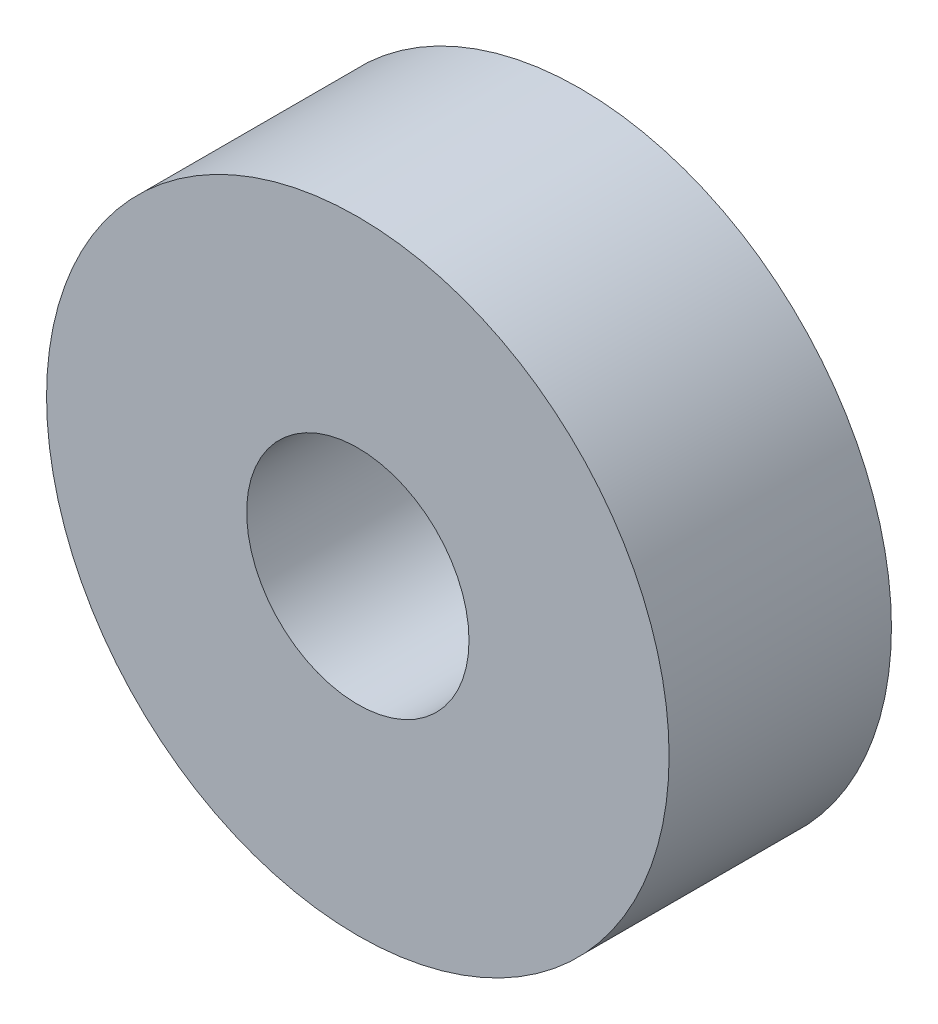
ISO-10303-21;
HEADER;
FILE_DESCRIPTION(('STEP AP214'),'2;1');
FILE_NAME('part.step','',(''),(''),'','','');
FILE_SCHEMA(('AUTOMOTIVE_DESIGN { 1 0 10303 214 1 1 1 1 }'));
ENDSEC;
DATA;
#1=APPLICATION_CONTEXT('core data for automotive mechanical design processes');
#2=APPLICATION_PROTOCOL_DEFINITION('international standard','automotive_design',2000,#1);
#3=PRODUCT_CONTEXT('',#1,'mechanical');
#4=PRODUCT('Part','Part','',(#3));
#5=PRODUCT_RELATED_PRODUCT_CATEGORY('part','',(#4));
#6=PRODUCT_DEFINITION_FORMATION('','',#4);
#7=PRODUCT_DEFINITION_CONTEXT('part definition',#1,'design');
#8=PRODUCT_DEFINITION('design','',#6,#7);
#9=PRODUCT_DEFINITION_SHAPE('','',#8);
#10=(LENGTH_UNIT() NAMED_UNIT(*) SI_UNIT(.MILLI.,.METRE.));
#11=(NAMED_UNIT(*) PLANE_ANGLE_UNIT() SI_UNIT($,.RADIAN.));
#12=(NAMED_UNIT(*) SI_UNIT($,.STERADIAN.) SOLID_ANGLE_UNIT());
#13=UNCERTAINTY_MEASURE_WITH_UNIT(LENGTH_MEASURE(1.E-05),#10,'distance_accuracy_value','');
#14=(GEOMETRIC_REPRESENTATION_CONTEXT(3) GLOBAL_UNCERTAINTY_ASSIGNED_CONTEXT((#13)) GLOBAL_UNIT_ASSIGNED_CONTEXT((#10,
#11,#12)) REPRESENTATION_CONTEXT('',''));
#15=CARTESIAN_POINT('',(0.,0.,0.));
#16=DIRECTION('',(0.,0.,1.));
#17=DIRECTION('',(1.,0.,0.));
#18=AXIS2_PLACEMENT_3D('',#15,#16,#17);
#19=CARTESIAN_POINT('',(0.,0.,5.));
#20=DIRECTION('',(0.,0.,1.));
#21=DIRECTION('',(1.,0.,0.));
#22=AXIS2_PLACEMENT_3D('',#19,#20,#21);
#23=PLANE('',#22);
#24=CARTESIAN_POINT('',(0.,0.,5.));
#25=DIRECTION('',(0.,0.,1.));
#26=DIRECTION('',(1.,0.,0.));
#27=AXIS2_PLACEMENT_3D('',#24,#25,#26);
#28=CIRCLE('',#27,7.);
#29=CARTESIAN_POINT('',(7.,0.,5.));
#30=VERTEX_POINT('',#29);
#31=EDGE_CURVE('E10',#30,#30,#28,.T.);
#32=ORIENTED_EDGE('',*,*,#31,.T.);
#33=EDGE_LOOP('',(#32));
#34=FACE_BOUND('',#33,.T.);
#35=CARTESIAN_POINT('',(0.,0.,5.));
#36=DIRECTION('',(0.,0.,1.));
#37=DIRECTION('',(1.,0.,0.));
#38=AXIS2_PLACEMENT_3D('',#35,#36,#37);
#39=CIRCLE('',#38,2.5);
#40=CARTESIAN_POINT('',(2.5,0.,5.));
#41=VERTEX_POINT('',#40);
#42=EDGE_CURVE('E43',#41,#41,#39,.T.);
#43=ORIENTED_EDGE('',*,*,#42,.F.);
#44=EDGE_LOOP('',(#43));
#45=FACE_BOUND('',#44,.T.);
#46=ADVANCED_FACE('F32',(#34,#45),#23,.T.);
#47=CARTESIAN_POINT('',(0.,0.,0.));
#48=DIRECTION('',(0.,0.,1.));
#49=DIRECTION('',(1.,0.,0.));
#50=AXIS2_PLACEMENT_3D('',#47,#48,#49);
#51=PLANE('',#50);
#52=CARTESIAN_POINT('',(0.,0.,0.));
#53=DIRECTION('',(0.,0.,1.));
#54=DIRECTION('',(1.,0.,0.));
#55=AXIS2_PLACEMENT_3D('',#52,#53,#54);
#56=CIRCLE('',#55,7.);
#57=CARTESIAN_POINT('',(7.,0.,0.));
#58=VERTEX_POINT('',#57);
#59=EDGE_CURVE('E36',#58,#58,#56,.T.);
#60=ORIENTED_EDGE('',*,*,#59,.F.);
#61=EDGE_LOOP('',(#60));
#62=FACE_BOUND('',#61,.T.);
#63=CARTESIAN_POINT('',(0.,0.,0.));
#64=DIRECTION('',(0.,0.,1.));
#65=DIRECTION('',(1.,0.,0.));
#66=AXIS2_PLACEMENT_3D('',#63,#64,#65);
#67=CIRCLE('',#66,2.5);
#68=CARTESIAN_POINT('',(2.5,0.,0.));
#69=VERTEX_POINT('',#68);
#70=EDGE_CURVE('E45',#69,#69,#67,.T.);
#71=ORIENTED_EDGE('',*,*,#70,.T.);
#72=EDGE_LOOP('',(#71));
#73=FACE_BOUND('',#72,.T.);
#74=ADVANCED_FACE('F55',(#62,#73),#51,.F.);
#75=CARTESIAN_POINT('',(0.,0.,5.));
#76=DIRECTION('',(0.,0.,-1.));
#77=DIRECTION('',(-1.,0.,0.));
#78=AXIS2_PLACEMENT_3D('',#75,#76,#77);
#79=CYLINDRICAL_SURFACE('',#78,7.);
#80=ORIENTED_EDGE('',*,*,#31,.F.);
#81=EDGE_LOOP('',(#80));
#82=FACE_BOUND('',#81,.T.);
#83=ORIENTED_EDGE('',*,*,#59,.T.);
#84=EDGE_LOOP('',(#83));
#85=FACE_BOUND('',#84,.T.);
#86=ADVANCED_FACE('F34',(#82,#85),#79,.T.);
#87=CARTESIAN_POINT('',(0.,0.,5.));
#88=DIRECTION('',(0.,0.,-1.));
#89=DIRECTION('',(-1.,0.,0.));
#90=AXIS2_PLACEMENT_3D('',#87,#88,#89);
#91=CYLINDRICAL_SURFACE('',#90,2.5);
#92=ORIENTED_EDGE('',*,*,#42,.T.);
#93=EDGE_LOOP('',(#92));
#94=FACE_BOUND('',#93,.T.);
#95=ORIENTED_EDGE('',*,*,#70,.F.);
#96=EDGE_LOOP('',(#95));
#97=FACE_BOUND('',#96,.T.);
#98=ADVANCED_FACE('F51',(#94,#97),#91,.F.);
#99=CLOSED_SHELL('',(#46,#74,#86,#98));
#100=MANIFOLD_SOLID_BREP('B2',#99);
#101=ADVANCED_BREP_SHAPE_REPRESENTATION('',(#18,#100),#14);
#102=SHAPE_DEFINITION_REPRESENTATION(#9,#101);
ENDSEC;
END-ISO-10303-21;
